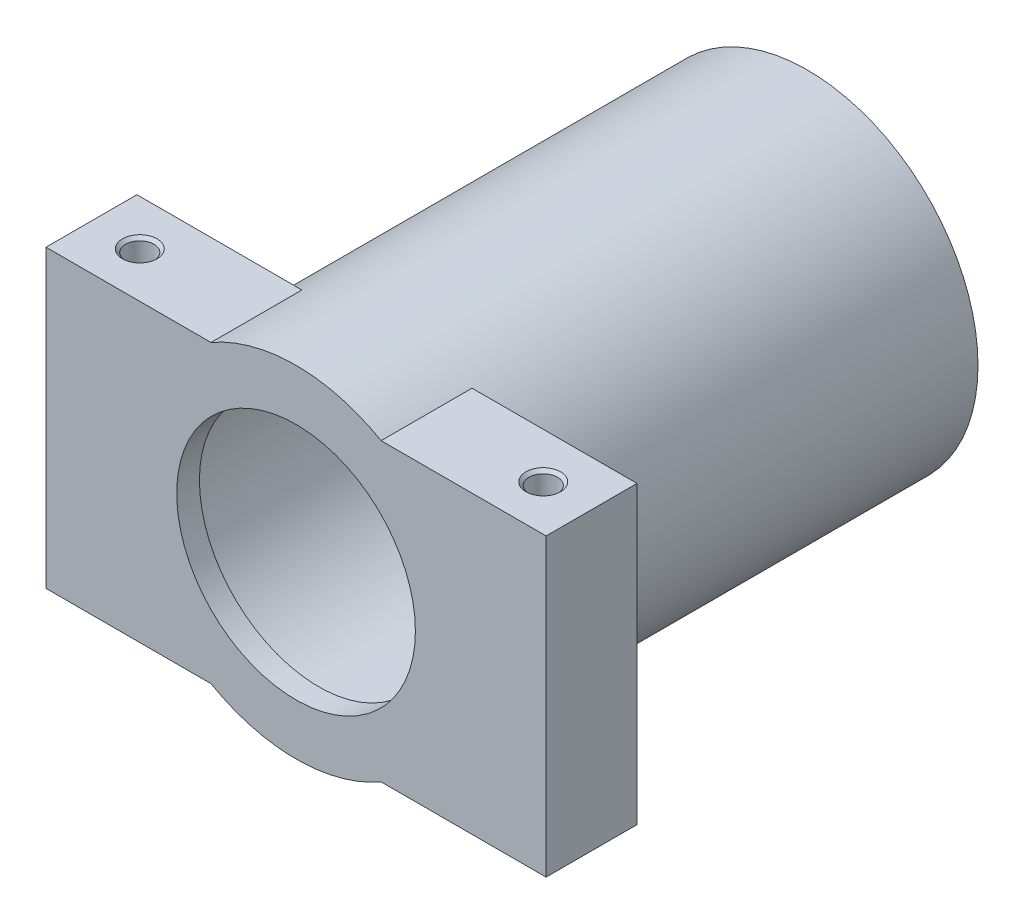
ISO-10303-21;
HEADER;
FILE_DESCRIPTION(('STEP AP214'),'2;1');
FILE_NAME('part.step','',(''),(''),'','','');
FILE_SCHEMA(('AUTOMOTIVE_DESIGN { 1 0 10303 214 1 1 1 1 }'));
ENDSEC;
DATA;
#1=APPLICATION_CONTEXT('core data for automotive mechanical design processes');
#2=APPLICATION_PROTOCOL_DEFINITION('international standard','automotive_design',2000,#1);
#3=PRODUCT_CONTEXT('',#1,'mechanical');
#4=PRODUCT('Part','Part','',(#3));
#5=PRODUCT_RELATED_PRODUCT_CATEGORY('part','',(#4));
#6=PRODUCT_DEFINITION_FORMATION('','',#4);
#7=PRODUCT_DEFINITION_CONTEXT('part definition',#1,'design');
#8=PRODUCT_DEFINITION('design','',#6,#7);
#9=PRODUCT_DEFINITION_SHAPE('','',#8);
#10=(LENGTH_UNIT() NAMED_UNIT(*) SI_UNIT(.MILLI.,.METRE.));
#11=(NAMED_UNIT(*) PLANE_ANGLE_UNIT() SI_UNIT($,.RADIAN.));
#12=(NAMED_UNIT(*) SI_UNIT($,.STERADIAN.) SOLID_ANGLE_UNIT());
#13=UNCERTAINTY_MEASURE_WITH_UNIT(LENGTH_MEASURE(1.E-05),#10,'distance_accuracy_value','');
#14=(GEOMETRIC_REPRESENTATION_CONTEXT(3) GLOBAL_UNCERTAINTY_ASSIGNED_CONTEXT((#13)) GLOBAL_UNIT_ASSIGNED_CONTEXT((#10,
#11,#12)) REPRESENTATION_CONTEXT('',''));
#15=CARTESIAN_POINT('',(0.,0.,0.));
#16=DIRECTION('',(0.,0.,1.));
#17=DIRECTION('',(1.,0.,0.));
#18=AXIS2_PLACEMENT_3D('',#15,#16,#17);
#19=CARTESIAN_POINT('',(0.,0.,37.));
#20=DIRECTION('',(0.,0.,1.));
#21=DIRECTION('',(1.,0.,0.));
#22=AXIS2_PLACEMENT_3D('',#19,#20,#21);
#23=CYLINDRICAL_SURFACE('',#22,10.5);
#24=CARTESIAN_POINT('',(0.,0.,45.));
#25=DIRECTION('',(0.,0.,1.));
#26=DIRECTION('',(1.,0.,0.));
#27=AXIS2_PLACEMENT_3D('',#24,#25,#26);
#28=CIRCLE('',#27,10.5);
#29=CARTESIAN_POINT('',(10.5,0.,45.));
#30=VERTEX_POINT('',#29);
#31=EDGE_CURVE('E137',#30,#30,#28,.T.);
#32=ORIENTED_EDGE('',*,*,#31,.T.);
#33=EDGE_LOOP('',(#32));
#34=FACE_BOUND('',#33,.T.);
#35=CARTESIAN_POINT('',(0.,0.,43.));
#36=DIRECTION('',(0.,0.,-1.));
#37=DIRECTION('',(-1.,0.,0.));
#38=AXIS2_PLACEMENT_3D('',#35,#36,#37);
#39=CIRCLE('',#38,10.5);
#40=CARTESIAN_POINT('',(-10.5,0.,43.));
#41=VERTEX_POINT('',#40);
#42=EDGE_CURVE('E43',#41,#41,#39,.F.);
#43=ORIENTED_EDGE('',*,*,#42,.F.);
#44=EDGE_LOOP('',(#43));
#45=FACE_BOUND('',#44,.T.);
#46=ADVANCED_FACE('F38',(#34,#45),#23,.F.);
#47=CARTESIAN_POINT('',(0.,0.,45.));
#48=DIRECTION('',(0.,0.,-1.));
#49=DIRECTION('',(-1.,0.,0.));
#50=AXIS2_PLACEMENT_3D('',#47,#48,#49);
#51=CYLINDRICAL_SURFACE('',#50,12.5);
#52=CARTESIAN_POINT('',(0.,-12.5,24.25));
#53=CARTESIAN_POINT('',(0.0700254422394448,-12.4999991940096,24.2499969676245));
#54=CARTESIAN_POINT('',(0.140097181459714,-12.4994053199526,24.2440959138794));
#55=CARTESIAN_POINT('',(0.278297998121044,-12.4970933449342,24.220644537137));
#56=CARTESIAN_POINT('',(0.346424848961032,-12.4953740054253,24.2030813799693));
#57=CARTESIAN_POINT('',(0.478714594316765,-12.4910051820384,24.1568221992527));
#58=CARTESIAN_POINT('',(0.542879855768633,-12.4883562600088,24.1281328993519));
#59=CARTESIAN_POINT('',(0.665470201200504,-12.4824244674288,24.0604488650854));
#60=CARTESIAN_POINT('',(0.723896423473841,-12.4791417229766,24.0214561799998));
#61=CARTESIAN_POINT('',(0.833574438342599,-12.4722968042665,23.9341216279222));
#62=CARTESIAN_POINT('',(0.884802681043612,-12.4687337696733,23.8857502507475));
#63=CARTESIAN_POINT('',(0.978428151788726,-12.4617369613283,23.7810943321712));
#64=CARTESIAN_POINT('',(1.02082497135331,-12.4583031935615,23.724809424947));
#65=CARTESIAN_POINT('',(1.09566746305452,-12.4519448944098,23.6057768353955));
#66=CARTESIAN_POINT('',(1.12809183181859,-12.4490214588863,23.5430156948814));
#67=CARTESIAN_POINT('',(1.18193298092844,-12.4440254693316,23.4129055176188));
#68=CARTESIAN_POINT('',(1.20335003323911,-12.4419528942778,23.3455565942701));
#69=CARTESIAN_POINT('',(1.23449880200236,-12.4389010509122,23.2084227489175));
#70=CARTESIAN_POINT('',(1.24426956625474,-12.4379181299762,23.1386467789347));
#71=CARTESIAN_POINT('',(1.2519691064192,-12.4371455382566,22.9984389207553));
#72=CARTESIAN_POINT('',(1.2498981935885,-12.4373558361093,22.9280070498474));
#73=CARTESIAN_POINT('',(1.23400535031584,-12.4389425862367,22.7887558628834));
#74=CARTESIAN_POINT('',(1.22022605515569,-12.4403148073831,22.7199316258391));
#75=CARTESIAN_POINT('',(1.18137393018823,-12.4440641785927,22.5855775459986));
#76=CARTESIAN_POINT('',(1.15630094781968,-12.4464413422311,22.5200477477187));
#77=CARTESIAN_POINT('',(1.09552611735188,-12.4519376181509,22.3940080158764));
#78=CARTESIAN_POINT('',(1.05980535339997,-12.455058048852,22.3335072631384));
#79=CARTESIAN_POINT('',(0.978762534191531,-12.461688146661,22.2193434813602));
#80=CARTESIAN_POINT('',(0.933440197920629,-12.4651978251598,22.1656806525228));
#81=CARTESIAN_POINT('',(0.834242640515084,-12.4722298164124,22.0664682575137));
#82=CARTESIAN_POINT('',(0.780330598564201,-12.4757521166625,22.020955497649));
#83=CARTESIAN_POINT('',(0.665611852171387,-12.4823978634815,21.939620458862));
#84=CARTESIAN_POINT('',(0.604805139999496,-12.4855213096032,21.9037981908044));
#85=CARTESIAN_POINT('',(0.477997632115451,-12.4910184458387,21.8428624746122));
#86=CARTESIAN_POINT('',(0.411995932987375,-12.4933920051846,21.8177508939774));
#87=CARTESIAN_POINT('',(0.276684021662413,-12.4971205930176,21.7789763541103));
#88=CARTESIAN_POINT('',(0.207373908470749,-12.4984756519633,21.7653130525117));
#89=CARTESIAN_POINT('',(0.0677313738648796,-12.5000106458539,21.7498696153315));
#90=CARTESIAN_POINT('',(-0.00259537763186505,-12.5001956033467,21.7480386896844));
#91=CARTESIAN_POINT('',(-0.142554741644625,-12.49938302196,21.756178578811));
#92=CARTESIAN_POINT('',(-0.212187363525588,-12.4983854990559,21.7661492341441));
#93=CARTESIAN_POINT('',(-0.348635258543344,-12.4953232692399,21.797567119277));
#94=CARTESIAN_POINT('',(-0.415456061215025,-12.4932607739755,21.8189905680975));
#95=CARTESIAN_POINT('',(-0.544555401729727,-12.4882999857576,21.8726814675466));
#96=CARTESIAN_POINT('',(-0.606833837696396,-12.4854016740657,21.9049491612992));
#97=CARTESIAN_POINT('',(-0.725310225215177,-12.4790809416303,21.9795385483299));
#98=CARTESIAN_POINT('',(-0.781487074686145,-12.475656795043,22.0218936111573));
#99=CARTESIAN_POINT('',(-0.885952029139846,-12.468674160869,22.1154075846762));
#100=CARTESIAN_POINT('',(-0.934239936061469,-12.4651156699121,22.1665667163379));
#101=CARTESIAN_POINT('',(-1.02173263735893,-12.4582503017594,22.2764582183238));
#102=CARTESIAN_POINT('',(-1.06090409834943,-12.4549443767372,22.3352171956783));
#103=CARTESIAN_POINT('',(-1.12882282342978,-12.4489729057611,22.4585092001834));
#104=CARTESIAN_POINT('',(-1.15757023006735,-12.4463073510505,22.5230421483605));
#105=CARTESIAN_POINT('',(-1.20376901085559,-12.4419243454256,22.6559359243322));
#106=CARTESIAN_POINT('',(-1.22124021851483,-12.4402052306224,22.7242898001139));
#107=CARTESIAN_POINT('',(-1.24445500891183,-12.437904566036,22.862978997451));
#108=CARTESIAN_POINT('',(-1.25019892799939,-12.4373229836273,22.9333142621196));
#109=CARTESIAN_POINT('',(-1.24979142308907,-12.4373639138445,23.0736383604459));
#110=CARTESIAN_POINT('',(-1.24369236199139,-12.4379811260876,23.1436273536035));
#111=CARTESIAN_POINT('',(-1.21988181620456,-12.4403387986193,23.2815811464604));
#112=CARTESIAN_POINT('',(-1.2021703184527,-12.4420792601715,23.3495459438825));
#113=CARTESIAN_POINT('',(-1.15565210787188,-12.4464858532898,23.4815216863098));
#114=CARTESIAN_POINT('',(-1.12684693042614,-12.4491518567545,23.5455331770372));
#115=CARTESIAN_POINT('',(-1.0589644436388,-12.455109397992,23.6678211145888));
#116=CARTESIAN_POINT('',(-1.01988719181927,-12.4584009322619,23.7260975935258));
#117=CARTESIAN_POINT('',(-0.932373195356663,-12.4652560901212,23.8355295930899));
#118=CARTESIAN_POINT('',(-0.883897436112835,-12.4688208090844,23.8866538454589));
#119=CARTESIAN_POINT('',(-0.779039624031386,-12.4758106841098,23.9800652908746));
#120=CARTESIAN_POINT('',(-0.72265568013532,-12.4792358065372,24.0223503641965));
#121=CARTESIAN_POINT('',(-0.603426792701611,-12.4855695258645,24.0969668173183));
#122=CARTESIAN_POINT('',(-0.540565936683454,-12.4884768003351,24.1292728636815));
#123=CARTESIAN_POINT('',(-0.410322848875688,-12.4934328656237,24.1828280285298));
#124=CARTESIAN_POINT('',(-0.342945812282012,-12.4954826238707,24.2040896136919));
#125=CARTESIAN_POINT('',(-0.229322826757131,-12.4979776721717,24.229650771356));
#126=CARTESIAN_POINT('',(-0.183803191055637,-12.4987325086479,24.2372713053742));
#127=CARTESIAN_POINT('',(-0.0921957260216422,-12.4997439368848,24.2474469075772));
#128=CARTESIAN_POINT('',(-0.0461078990331985,-12.5000005307003,24.2500019966523));
#129=CARTESIAN_POINT('',(0.,-12.5,24.25));
#130=B_SPLINE_CURVE_WITH_KNOTS('',3,(#52,#53,#54,#55,#56,#57,#58,#59,#60,#61,#62,#63,#64,#65,
#66,#67,#68,#69,#70,#71,#72,#73,#74,#75,#76,#77,#78,#79,#80,#81,#82,#83,#84,#85,#86,#87,#88,#89,
#90,#91,#92,#93,#94,#95,#96,#97,#98,#99,#100,#101,#102,#103,#104,#105,#106,#107,#108,#109,#110,
#111,#112,#113,#114,#115,#116,#117,#118,#119,#120,#121,#122,#123,#124,#125,#126,#127,#128,#129),
.UNSPECIFIED.,.T.,.F.,(4,2,2,2,2,2,2,2,2,2,2,2,2,2,2,2,2,2,2,2,2,2,2,2,2,2,2,2,2,2,2,2,2,2,2,2,
2,2,4),(0.,0.209907957835591,0.420047303544357,0.630059857165251,0.840030671978474,
1.05067321077868,1.26132549025882,1.47242469340277,1.68351868053129,1.89390290056495,
2.1042815906972,2.31389746801388,2.52351617702041,2.73350951716117,2.94350900413906,
3.15443417745258,3.36535958724714,3.57632175866976,3.78727762094298,3.99732735759696,
4.20737425648928,4.4169866911788,4.62660382561833,4.83692425935872,5.04724997262786,
5.25833304510747,5.46941323094216,5.68012113241253,5.8908229904948,6.10059536617444,
6.31036797782548,6.52011156703498,6.72985398173698,6.94048646784565,7.15116940796195,
7.36238288782801,7.57335743494117,7.71157084040434,7.84978367586282),.UNSPECIFIED.);
#131=CARTESIAN_POINT('',(0.,-12.5,24.25));
#132=VERTEX_POINT('',#131);
#133=EDGE_CURVE('E201',#132,#132,#130,.T.);
#134=ORIENTED_EDGE('',*,*,#133,.F.);
#135=EDGE_LOOP('',(#134));
#136=FACE_BOUND('',#135,.T.);
#137=CARTESIAN_POINT('',(0.,12.5,24.25));
#138=CARTESIAN_POINT('',(-0.0700254422394479,12.4999991940096,24.2499969676245));
#139=CARTESIAN_POINT('',(-0.140097181459717,12.4994053199526,24.2440959138794));
#140=CARTESIAN_POINT('',(-0.278297998121047,12.4970933449342,24.220644537137));
#141=CARTESIAN_POINT('',(-0.346424848961035,12.4953740054253,24.2030813799693));
#142=CARTESIAN_POINT('',(-0.478714594316768,12.4910051820384,24.1568221992527));
#143=CARTESIAN_POINT('',(-0.542879855768636,12.4883562600089,24.1281328993519));
#144=CARTESIAN_POINT('',(-0.665470201200507,12.4824244674288,24.0604488650854));
#145=CARTESIAN_POINT('',(-0.723896423473844,12.4791417229766,24.0214561799998));
#146=CARTESIAN_POINT('',(-0.833574438342602,12.4722968042665,23.9341216279222));
#147=CARTESIAN_POINT('',(-0.884802681043615,12.4687337696733,23.8857502507475));
#148=CARTESIAN_POINT('',(-0.97842815178873,12.4617369613283,23.7810943321712));
#149=CARTESIAN_POINT('',(-1.02082497135332,12.4583031935615,23.724809424947));
#150=CARTESIAN_POINT('',(-1.09566746305452,12.4519448944098,23.6057768353955));
#151=CARTESIAN_POINT('',(-1.1280918318186,12.4490214588863,23.5430156948814));
#152=CARTESIAN_POINT('',(-1.18193298092845,12.4440254693316,23.4129055176188));
#153=CARTESIAN_POINT('',(-1.20335003323911,12.4419528942778,23.3455565942701));
#154=CARTESIAN_POINT('',(-1.23449880200237,12.4389010509122,23.2084227489175));
#155=CARTESIAN_POINT('',(-1.24426956625474,12.4379181299762,23.1386467789347));
#156=CARTESIAN_POINT('',(-1.2519691064192,12.4371455382566,22.9984389207553));
#157=CARTESIAN_POINT('',(-1.2498981935885,12.4373558361093,22.9280070498474));
#158=CARTESIAN_POINT('',(-1.23400535031585,12.4389425862367,22.7887558628833));
#159=CARTESIAN_POINT('',(-1.22022605515569,12.4403148073831,22.7199316258391));
#160=CARTESIAN_POINT('',(-1.18137393018823,12.4440641785927,22.5855775459986));
#161=CARTESIAN_POINT('',(-1.15630094781968,12.4464413422311,22.5200477477187));
#162=CARTESIAN_POINT('',(-1.09552611735188,12.4519376181509,22.3940080158764));
#163=CARTESIAN_POINT('',(-1.05980535339997,12.455058048852,22.3335072631384));
#164=CARTESIAN_POINT('',(-0.978762534191534,12.461688146661,22.2193434813602));
#165=CARTESIAN_POINT('',(-0.933440197920632,12.4651978251598,22.1656806525228));
#166=CARTESIAN_POINT('',(-0.834242640515087,12.4722298164124,22.0664682575137));
#167=CARTESIAN_POINT('',(-0.780330598564205,12.4757521166625,22.020955497649));
#168=CARTESIAN_POINT('',(-0.66561185217139,12.4823978634815,21.939620458862));
#169=CARTESIAN_POINT('',(-0.6048051399995,12.4855213096032,21.9037981908044));
#170=CARTESIAN_POINT('',(-0.477997632115454,12.4910184458387,21.8428624746122));
#171=CARTESIAN_POINT('',(-0.411995932987378,12.4933920051846,21.8177508939774));
#172=CARTESIAN_POINT('',(-0.276684021662415,12.4971205930176,21.7789763541103));
#173=CARTESIAN_POINT('',(-0.207373908470751,12.4984756519633,21.7653130525117));
#174=CARTESIAN_POINT('',(-0.0677313738648814,12.5000106458539,21.7498696153315));
#175=CARTESIAN_POINT('',(0.0025953776318632,12.5001956033467,21.7480386896844));
#176=CARTESIAN_POINT('',(0.142554741644623,12.49938302196,21.756178578811));
#177=CARTESIAN_POINT('',(0.212187363525585,12.4983854990559,21.7661492341441));
#178=CARTESIAN_POINT('',(0.348635258543341,12.4953232692399,21.797567119277));
#179=CARTESIAN_POINT('',(0.415456061215021,12.4932607739755,21.8189905680975));
#180=CARTESIAN_POINT('',(0.544555401729723,12.4882999857576,21.8726814675466));
#181=CARTESIAN_POINT('',(0.606833837696393,12.4854016740657,21.9049491612992));
#182=CARTESIAN_POINT('',(0.725310225215174,12.4790809416303,21.9795385483299));
#183=CARTESIAN_POINT('',(0.781487074686142,12.475656795043,22.0218936111573));
#184=CARTESIAN_POINT('',(0.885952029139843,12.468674160869,22.1154075846762));
#185=CARTESIAN_POINT('',(0.934239936061466,12.4651156699121,22.1665667163379));
#186=CARTESIAN_POINT('',(1.02173263735893,12.4582503017594,22.2764582183238));
#187=CARTESIAN_POINT('',(1.06090409834942,12.4549443767372,22.3352171956783));
#188=CARTESIAN_POINT('',(1.12882282342978,12.4489729057611,22.4585092001834));
#189=CARTESIAN_POINT('',(1.15757023006735,12.4463073510505,22.5230421483605));
#190=CARTESIAN_POINT('',(1.20376901085559,12.4419243454256,22.6559359243322));
#191=CARTESIAN_POINT('',(1.22124021851482,12.4402052306224,22.7242898001139));
#192=CARTESIAN_POINT('',(1.24445500891182,12.437904566036,22.862978997451));
#193=CARTESIAN_POINT('',(1.25019892799939,12.4373229836273,22.9333142621196));
#194=CARTESIAN_POINT('',(1.24979142308907,12.4373639138445,23.0736383604459));
#195=CARTESIAN_POINT('',(1.24369236199139,12.4379811260876,23.1436273536035));
#196=CARTESIAN_POINT('',(1.21988181620456,12.4403387986193,23.2815811464604));
#197=CARTESIAN_POINT('',(1.20217031845269,12.4420792601715,23.3495459438825));
#198=CARTESIAN_POINT('',(1.15565210787188,12.4464858532898,23.4815216863098));
#199=CARTESIAN_POINT('',(1.12684693042614,12.4491518567545,23.5455331770372));
#200=CARTESIAN_POINT('',(1.0589644436388,12.455109397992,23.6678211145888));
#201=CARTESIAN_POINT('',(1.01988719181927,12.4584009322619,23.7260975935258));
#202=CARTESIAN_POINT('',(0.932373195356662,12.4652560901212,23.8355295930899));
#203=CARTESIAN_POINT('',(0.883897436112833,12.4688208090844,23.8866538454589));
#204=CARTESIAN_POINT('',(0.779039624031384,12.4758106841098,23.9800652908746));
#205=CARTESIAN_POINT('',(0.722655680135317,12.4792358065372,24.0223503641965));
#206=CARTESIAN_POINT('',(0.603426792701608,12.4855695258645,24.0969668173183));
#207=CARTESIAN_POINT('',(0.540565936683451,12.4884768003351,24.1292728636815));
#208=CARTESIAN_POINT('',(0.410322848875685,12.4934328656237,24.1828280285298));
#209=CARTESIAN_POINT('',(0.342945812282008,12.4954826238707,24.2040896136919));
#210=CARTESIAN_POINT('',(0.229322826757128,12.4979776721717,24.229650771356));
#211=CARTESIAN_POINT('',(0.183803191055634,12.4987325086479,24.2372713053742));
#212=CARTESIAN_POINT('',(0.0921957260216392,12.4997439368848,24.2474469075772));
#213=CARTESIAN_POINT('',(0.0461078990331955,12.5000005307003,24.2500019966523));
#214=CARTESIAN_POINT('',(0.,12.5,24.25));
#215=B_SPLINE_CURVE_WITH_KNOTS('',3,(#137,#138,#139,#140,#141,#142,#143,#144,#145,#146,#147,
#148,#149,#150,#151,#152,#153,#154,#155,#156,#157,#158,#159,#160,#161,#162,#163,#164,#165,#166,
#167,#168,#169,#170,#171,#172,#173,#174,#175,#176,#177,#178,#179,#180,#181,#182,#183,#184,#185,
#186,#187,#188,#189,#190,#191,#192,#193,#194,#195,#196,#197,#198,#199,#200,#201,#202,#203,#204,
#205,#206,#207,#208,#209,#210,#211,#212,#213,#214),.UNSPECIFIED.,.T.,.F.,(4,2,2,2,2,2,2,2,2,2,2,
2,2,2,2,2,2,2,2,2,2,2,2,2,2,2,2,2,2,2,2,2,2,2,2,2,2,2,4),(0.,0.209907957835591,
0.420047303544357,0.630059857165251,0.840030671978474,1.05067321077868,1.26132549025882,
1.47242469340277,1.68351868053129,1.89390290056495,2.1042815906972,2.31389746801388,
2.52351617702041,2.73350951716117,2.94350900413906,3.15443417745257,3.36535958724714,
3.57632175866976,3.78727762094298,3.99732735759696,4.20737425648928,4.4169866911788,
4.62660382561832,4.83692425935872,5.04724997262786,5.25833304510747,5.46941323094216,
5.68012113241253,5.8908229904948,6.10059536617444,6.31036797782548,6.52011156703498,
6.72985398173698,6.94048646784565,7.15116940796196,7.36238288782801,7.57335743494117,
7.71157084040434,7.84978367586282),.UNSPECIFIED.);
#216=CARTESIAN_POINT('',(0.,12.5,24.25));
#217=VERTEX_POINT('',#216);
#218=EDGE_CURVE('E195',#217,#217,#215,.T.);
#219=ORIENTED_EDGE('',*,*,#218,.F.);
#220=EDGE_LOOP('',(#219));
#221=FACE_BOUND('',#220,.T.);
#222=CARTESIAN_POINT('',(0.,0.,0.));
#223=DIRECTION('',(0.,0.,1.));
#224=DIRECTION('',(1.,0.,0.));
#225=AXIS2_PLACEMENT_3D('',#222,#223,#224);
#226=CIRCLE('',#225,12.5);
#227=CARTESIAN_POINT('',(12.5,0.,0.));
#228=VERTEX_POINT('',#227);
#229=EDGE_CURVE('E158',#228,#228,#226,.T.);
#230=ORIENTED_EDGE('',*,*,#229,.F.);
#231=EDGE_LOOP('',(#230));
#232=FACE_BOUND('',#231,.T.);
#233=CARTESIAN_POINT('',(0.,0.,43.));
#234=DIRECTION('',(0.,0.,-1.));
#235=DIRECTION('',(-1.,0.,0.));
#236=AXIS2_PLACEMENT_3D('',#233,#234,#235);
#237=CIRCLE('',#236,12.5);
#238=CARTESIAN_POINT('',(-12.5,0.,43.));
#239=VERTEX_POINT('',#238);
#240=EDGE_CURVE('E284',#239,#239,#237,.T.);
#241=ORIENTED_EDGE('',*,*,#240,.F.);
#242=EDGE_LOOP('',(#241));
#243=FACE_BOUND('',#242,.T.);
#244=ADVANCED_FACE('F206',(#136,#221,#232,#243),#51,.F.);
#245=CARTESIAN_POINT('',(0.,0.,45.));
#246=DIRECTION('',(0.,0.,1.));
#247=DIRECTION('',(1.,0.,0.));
#248=AXIS2_PLACEMENT_3D('',#245,#246,#247);
#249=PLANE('',#248);
#250=CARTESIAN_POINT('',(0.,0.,45.));
#251=DIRECTION('',(0.,0.,1.));
#252=DIRECTION('',(1.,0.,0.));
#253=AXIS2_PLACEMENT_3D('',#250,#251,#252);
#254=CIRCLE('',#253,15.);
#255=CARTESIAN_POINT('',(-7.48331477354788,-13.,45.));
#256=VERTEX_POINT('',#255);
#257=CARTESIAN_POINT('',(7.48331477354789,-13.,45.));
#258=VERTEX_POINT('',#257);
#259=EDGE_CURVE('E165',#256,#258,#254,.T.);
#260=ORIENTED_EDGE('',*,*,#259,.T.);
#261=DIRECTION('',(1.,0.,0.));
#262=VECTOR('',#261,1.);
#263=CARTESIAN_POINT('',(22.,-13.,45.));
#264=LINE('',#263,#262);
#265=CARTESIAN_POINT('',(22.,-13.,45.));
#266=VERTEX_POINT('',#265);
#267=EDGE_CURVE('E147',#258,#266,#264,.T.);
#268=ORIENTED_EDGE('',*,*,#267,.T.);
#269=DIRECTION('',(0.,1.,0.));
#270=VECTOR('',#269,1.);
#271=CARTESIAN_POINT('',(22.,-13.,45.));
#272=LINE('',#271,#270);
#273=CARTESIAN_POINT('',(22.,13.,45.));
#274=VERTEX_POINT('',#273);
#275=EDGE_CURVE('E149',#266,#274,#272,.T.);
#276=ORIENTED_EDGE('',*,*,#275,.T.);
#277=DIRECTION('',(-1.,0.,0.));
#278=VECTOR('',#277,1.);
#279=CARTESIAN_POINT('',(22.,13.,45.));
#280=LINE('',#279,#278);
#281=CARTESIAN_POINT('',(7.48331477354789,13.,45.));
#282=VERTEX_POINT('',#281);
#283=EDGE_CURVE('E63',#274,#282,#280,.T.);
#284=ORIENTED_EDGE('',*,*,#283,.T.);
#285=CARTESIAN_POINT('',(-7.48331477354789,13.,45.));
#286=VERTEX_POINT('',#285);
#287=EDGE_CURVE('E162',#282,#286,#254,.T.);
#288=ORIENTED_EDGE('',*,*,#287,.T.);
#289=CARTESIAN_POINT('',(-22.,13.,45.));
#290=VERTEX_POINT('',#289);
#291=EDGE_CURVE('E134',#286,#290,#280,.T.);
#292=ORIENTED_EDGE('',*,*,#291,.T.);
#293=DIRECTION('',(0.,-1.,0.));
#294=VECTOR('',#293,1.);
#295=CARTESIAN_POINT('',(-22.,-13.,45.));
#296=LINE('',#295,#294);
#297=CARTESIAN_POINT('',(-22.,-13.,45.));
#298=VERTEX_POINT('',#297);
#299=EDGE_CURVE('E145',#290,#298,#296,.T.);
#300=ORIENTED_EDGE('',*,*,#299,.T.);
#301=EDGE_CURVE('E56',#298,#256,#264,.T.);
#302=ORIENTED_EDGE('',*,*,#301,.T.);
#303=EDGE_LOOP('',(#260,#268,#276,#284,#288,#292,#300,#302));
#304=FACE_BOUND('',#303,.T.);
#305=ORIENTED_EDGE('',*,*,#31,.F.);
#306=EDGE_LOOP('',(#305));
#307=FACE_BOUND('',#306,.T.);
#308=ADVANCED_FACE('F211',(#304,#307),#249,.T.);
#309=CARTESIAN_POINT('',(0.,0.,0.));
#310=DIRECTION('',(0.,0.,1.));
#311=DIRECTION('',(1.,0.,0.));
#312=AXIS2_PLACEMENT_3D('',#309,#310,#311);
#313=PLANE('',#312);
#314=CARTESIAN_POINT('',(0.,0.,0.));
#315=DIRECTION('',(0.,0.,1.));
#316=DIRECTION('',(1.,0.,0.));
#317=AXIS2_PLACEMENT_3D('',#314,#315,#316);
#318=CIRCLE('',#317,15.);
#319=CARTESIAN_POINT('',(15.,0.,0.));
#320=VERTEX_POINT('',#319);
#321=EDGE_CURVE('E161',#320,#320,#318,.T.);
#322=ORIENTED_EDGE('',*,*,#321,.F.);
#323=EDGE_LOOP('',(#322));
#324=FACE_BOUND('',#323,.T.);
#325=ORIENTED_EDGE('',*,*,#229,.T.);
#326=EDGE_LOOP('',(#325));
#327=FACE_BOUND('',#326,.T.);
#328=ADVANCED_FACE('F216',(#324,#327),#313,.F.);
#329=CARTESIAN_POINT('',(0.,0.,45.));
#330=DIRECTION('',(0.,0.,-1.));
#331=DIRECTION('',(-1.,0.,0.));
#332=AXIS2_PLACEMENT_3D('',#329,#330,#331);
#333=CYLINDRICAL_SURFACE('',#332,15.);
#334=CARTESIAN_POINT('',(0.,-15.,24.25));
#335=CARTESIAN_POINT('',(0.0700826124015035,-14.999999317644,24.2499969389671));
#336=CARTESIAN_POINT('',(0.14021293397528,-14.9995036067925,24.2440862877362));
#337=CARTESIAN_POINT('',(0.278533213375484,-14.9975737791031,24.2205945601811));
#338=CARTESIAN_POINT('',(0.346720881531535,-14.9961385991462,24.2030002621189));
#339=CARTESIAN_POINT('',(0.479132528142823,-14.9924920155763,24.1566535577383));
#340=CARTESIAN_POINT('',(0.543358725530766,-14.9902810512311,24.1279074648627));
#341=CARTESIAN_POINT('',(0.666059041770092,-14.9853308468089,24.06008446016));
#342=CARTESIAN_POINT('',(0.724534387356732,-14.982591719767,24.0210097581531));
#343=CARTESIAN_POINT('',(0.834237499956984,-14.9768847483339,23.9335311667425));
#344=CARTESIAN_POINT('',(0.885448590520197,-14.9739164010822,23.8851063950804));
#345=CARTESIAN_POINT('',(0.979026416920687,-14.9680897600396,23.7803463801876));
#346=CARTESIAN_POINT('',(1.02139276421438,-14.965231471088,23.7240107896217));
#347=CARTESIAN_POINT('',(1.09613490298778,-14.9599431582655,23.6049273536262));
#348=CARTESIAN_POINT('',(1.12849604118942,-14.9575137647512,23.5421702807465));
#349=CARTESIAN_POINT('',(1.1822155422173,-14.9533640556034,23.412089630555));
#350=CARTESIAN_POINT('',(1.20357409939052,-14.9516437274454,23.3447661339272));
#351=CARTESIAN_POINT('',(1.23463378727321,-14.949111150829,23.2076307601485));
#352=CARTESIAN_POINT('',(1.24436208173721,-14.9482967867027,23.1378250750092));
#353=CARTESIAN_POINT('',(1.25196901001928,-14.9476616540184,22.9975672450683));
#354=CARTESIAN_POINT('',(1.24984786622442,-14.9478408668132,22.9271151124237));
#355=CARTESIAN_POINT('',(1.23383858026856,-14.9491707170205,22.7877504181118));
#356=CARTESIAN_POINT('',(1.21997996004757,-14.9503189172232,22.7188344386545));
#357=CARTESIAN_POINT('',(1.18093498172867,-14.9534535446171,22.5843101657588));
#358=CARTESIAN_POINT('',(1.15574851299598,-14.955439979995,22.5187019046327));
#359=CARTESIAN_POINT('',(1.09472973519004,-14.9600300588357,22.3925613676524));
#360=CARTESIAN_POINT('',(1.05888418094649,-14.962634469387,22.3320355280156));
#361=CARTESIAN_POINT('',(0.977574304891682,-14.9681663357985,22.2178483264752));
#362=CARTESIAN_POINT('',(0.932109788278174,-14.9710937982004,22.1641871036285));
#363=CARTESIAN_POINT('',(0.832686977782951,-14.9769527551456,22.065080725898));
#364=CARTESIAN_POINT('',(0.778703161738216,-14.9798842346883,22.0196611698384));
#365=CARTESIAN_POINT('',(0.663863195464687,-14.9854123983729,21.9385253457643));
#366=CARTESIAN_POINT('',(0.60300704064417,-14.9880090822911,21.9028090842331));
#367=CARTESIAN_POINT('',(0.476133241584813,-14.9925755726205,21.8420952966641));
#368=CARTESIAN_POINT('',(0.410115052261341,-14.994545312718,21.8170989044023));
#369=CARTESIAN_POINT('',(0.274798836274475,-14.9976352176475,21.7785523344358));
#370=CARTESIAN_POINT('',(0.205500877711067,-14.9987554001111,21.7650019191809));
#371=CARTESIAN_POINT('',(0.0658141252053121,-15.0000177117881,21.749764044948));
#372=CARTESIAN_POINT('',(-0.00457078639399648,-15.00016275615,21.7480412273664));
#373=CARTESIAN_POINT('',(-0.14462844062913,-14.9994662347338,21.7564148257841));
#374=CARTESIAN_POINT('',(-0.214301189901767,-14.9986246781584,21.7665111315368));
#375=CARTESIAN_POINT('',(-0.350855945280874,-14.9960514730165,21.7982070732626));
#376=CARTESIAN_POINT('',(-0.417741781424653,-14.9943210927178,21.8197903200323));
#377=CARTESIAN_POINT('',(-0.546942706353111,-14.9901646264044,21.8738307347275));
#378=CARTESIAN_POINT('',(-0.609257722853915,-14.9877385293905,21.9062880745731));
#379=CARTESIAN_POINT('',(-0.727709022877383,-14.9824553299204,21.9812441865204));
#380=CARTESIAN_POINT('',(-0.783830438151836,-14.9795972277342,22.0237663829935));
#381=CARTESIAN_POINT('',(-0.888151368554525,-14.9737744829962,22.1176113213131));
#382=CARTESIAN_POINT('',(-0.936350746017978,-14.9708098385941,22.1689342160616));
#383=CARTESIAN_POINT('',(-1.02358068181888,-14.9650995151978,22.2790771152479));
#384=CARTESIAN_POINT('',(-1.06258816654205,-14.9623543984278,22.3379154264967));
#385=CARTESIAN_POINT('',(-1.1301688285494,-14.957401896804,22.4613278285793));
#386=CARTESIAN_POINT('',(-1.15874211001245,-14.9551945065814,22.5259018621374));
#387=CARTESIAN_POINT('',(-1.2046039718007,-14.9515705356118,22.6588709881741));
#388=CARTESIAN_POINT('',(-1.22190667681161,-14.9501529653579,22.7272611808929));
#389=CARTESIAN_POINT('',(-1.24478221238769,-14.9482658211356,22.865988374843));
#390=CARTESIAN_POINT('',(-1.25035526821033,-14.9477962289621,22.936325338662));
#391=CARTESIAN_POINT('',(-1.24961070361366,-14.9478584743774,23.0767201575261));
#392=CARTESIAN_POINT('',(-1.24332933722174,-14.9483872586634,23.1467782090455));
#393=CARTESIAN_POINT('',(-1.21912982911879,-14.9503801885288,23.2848406669386));
#394=CARTESIAN_POINT('',(-1.20121166965953,-14.9518443355349,23.3528450701798));
#395=CARTESIAN_POINT('',(-1.15425638752133,-14.9555422141463,23.4848722040833));
#396=CARTESIAN_POINT('',(-1.12521991750817,-14.9577759005774,23.5488951682071));
#397=CARTESIAN_POINT('',(-1.05685632368406,-14.9627612484384,23.6711635507171));
#398=CARTESIAN_POINT('',(-1.0175293613932,-14.9655129017381,23.7294090597667));
#399=CARTESIAN_POINT('',(-0.929564927653059,-14.9712341462335,23.8386546737663));
#400=CARTESIAN_POINT('',(-0.880900617176823,-14.9742043500718,23.8896331358217));
#401=CARTESIAN_POINT('',(-0.775691531990582,-14.980022437621,23.9827189815041));
#402=CARTESIAN_POINT('',(-0.719144853301366,-14.9828702915603,24.02482421562));
#403=CARTESIAN_POINT('',(-0.599667216286771,-14.9881279355284,24.099024825522));
#404=CARTESIAN_POINT('',(-0.536724570338175,-14.9905369002888,24.1311014233204));
#405=CARTESIAN_POINT('',(-0.406369689994668,-14.9946356564537,24.1841897538141));
#406=CARTESIAN_POINT('',(-0.338962694267064,-14.9963262741032,24.2052142053601));
#407=CARTESIAN_POINT('',(-0.225965060120849,-14.9983638466731,24.2302469781276));
#408=CARTESIAN_POINT('',(-0.181101118048088,-14.9989746109619,24.2376445156469));
#409=CARTESIAN_POINT('',(-0.0908314643764535,-14.9997929082329,24.2475220120965));
#410=CARTESIAN_POINT('',(-0.0454257542163072,-15.0000004422857,24.2500019840831));
#411=CARTESIAN_POINT('',(0.,-15.,24.25));
#412=B_SPLINE_CURVE_WITH_KNOTS('',3,(#334,#335,#336,#337,#338,#339,#340,#341,#342,#343,#344,
#345,#346,#347,#348,#349,#350,#351,#352,#353,#354,#355,#356,#357,#358,#359,#360,#361,#362,#363,
#364,#365,#366,#367,#368,#369,#370,#371,#372,#373,#374,#375,#376,#377,#378,#379,#380,#381,#382,
#383,#384,#385,#386,#387,#388,#389,#390,#391,#392,#393,#394,#395,#396,#397,#398,#399,#400,#401,
#402,#403,#404,#405,#406,#407,#408,#409,#410,#411),.UNSPECIFIED.,.T.,.F.,(4,2,2,2,2,2,2,2,2,2,2,
2,2,2,2,2,2,2,2,2,2,2,2,2,2,2,2,2,2,2,2,2,2,2,2,2,2,2,4),(0.,0.210081983500173,
0.420402111247292,0.630603342361191,0.840759636980224,1.0513908359822,1.26203128592414,
1.47297878688864,1.68392256159875,1.89437268539482,2.10481885953273,2.31473728887861,
2.52465776846248,2.73484019686123,2.94502688226074,3.15585563668936,3.36668453198305,
3.57753571988062,3.78838253165668,3.9985987413396,4.20881299017775,4.4187281128848,
4.62864655451714,4.83905843718657,5.04947397589062,5.26041220614001,5.47134833024784,
5.68201959051159,5.89268680498446,6.10271078603158,6.31273508740423,6.52274706184402,
6.73275574012318,6.94337735830797,7.15404994040599,7.3651146632819,7.5759359573973,
7.71210607945826,7.8482758399843),.UNSPECIFIED.);
#413=CARTESIAN_POINT('',(0.,-15.,24.25));
#414=VERTEX_POINT('',#413);
#415=EDGE_CURVE('E11',#414,#414,#412,.T.);
#416=ORIENTED_EDGE('',*,*,#415,.T.);
#417=EDGE_LOOP('',(#416));
#418=FACE_BOUND('',#417,.T.);
#419=CARTESIAN_POINT('',(0.,0.,37.));
#420=DIRECTION('',(0.,0.,1.));
#421=DIRECTION('',(1.,0.,0.));
#422=AXIS2_PLACEMENT_3D('',#419,#420,#421);
#423=CIRCLE('',#422,15.);
#424=CARTESIAN_POINT('',(-7.48331477354789,13.,37.));
#425=VERTEX_POINT('',#424);
#426=CARTESIAN_POINT('',(-7.48331477354788,-13.,37.));
#427=VERTEX_POINT('',#426);
#428=EDGE_CURVE('E125',#425,#427,#423,.T.);
#429=ORIENTED_EDGE('',*,*,#428,.F.);
#430=DIRECTION('',(0.,0.,-1.));
#431=VECTOR('',#430,1.);
#432=CARTESIAN_POINT('',(-7.48331477354789,13.,45.));
#433=LINE('',#432,#431);
#434=EDGE_CURVE('E48',#425,#286,#433,.F.);
#435=ORIENTED_EDGE('',*,*,#434,.T.);
#436=ORIENTED_EDGE('',*,*,#287,.F.);
#437=DIRECTION('',(0.,0.,-1.));
#438=VECTOR('',#437,1.);
#439=CARTESIAN_POINT('',(7.48331477354788,13.,45.));
#440=LINE('',#439,#438);
#441=CARTESIAN_POINT('',(7.48331477354789,13.,37.));
#442=VERTEX_POINT('',#441);
#443=EDGE_CURVE('E170',#282,#442,#440,.T.);
#444=ORIENTED_EDGE('',*,*,#443,.T.);
#445=CARTESIAN_POINT('',(7.48331477354789,-13.,37.));
#446=VERTEX_POINT('',#445);
#447=EDGE_CURVE('E152',#446,#442,#423,.T.);
#448=ORIENTED_EDGE('',*,*,#447,.F.);
#449=DIRECTION('',(0.,0.,-1.));
#450=VECTOR('',#449,1.);
#451=CARTESIAN_POINT('',(7.48331477354788,-13.,45.));
#452=LINE('',#451,#450);
#453=EDGE_CURVE('E164',#446,#258,#452,.F.);
#454=ORIENTED_EDGE('',*,*,#453,.T.);
#455=ORIENTED_EDGE('',*,*,#259,.F.);
#456=DIRECTION('',(0.,0.,-1.));
#457=VECTOR('',#456,1.);
#458=CARTESIAN_POINT('',(-7.48331477354788,-13.,45.));
#459=LINE('',#458,#457);
#460=EDGE_CURVE('E173',#256,#427,#459,.T.);
#461=ORIENTED_EDGE('',*,*,#460,.T.);
#462=EDGE_LOOP('',(#429,#435,#436,#444,#448,#454,#455,#461));
#463=FACE_BOUND('',#462,.T.);
#464=ORIENTED_EDGE('',*,*,#321,.T.);
#465=EDGE_LOOP('',(#464));
#466=FACE_BOUND('',#465,.T.);
#467=ADVANCED_FACE('F40',(#418,#463,#466),#333,.T.);
#468=CARTESIAN_POINT('',(22.,-13.,37.));
#469=DIRECTION('',(1.,0.,0.));
#470=DIRECTION('',(0.,0.,-1.));
#471=AXIS2_PLACEMENT_3D('',#468,#469,#470);
#472=PLANE('',#471);
#473=ORIENTED_EDGE('',*,*,#275,.F.);
#474=DIRECTION('',(0.,0.,1.));
#475=VECTOR('',#474,1.);
#476=CARTESIAN_POINT('',(22.,-13.,37.));
#477=LINE('',#476,#475);
#478=CARTESIAN_POINT('',(22.,-13.,37.));
#479=VERTEX_POINT('',#478);
#480=EDGE_CURVE('E116',#479,#266,#477,.T.);
#481=ORIENTED_EDGE('',*,*,#480,.F.);
#482=DIRECTION('',(0.,1.,0.));
#483=VECTOR('',#482,1.);
#484=CARTESIAN_POINT('',(22.,-13.,37.));
#485=LINE('',#484,#483);
#486=CARTESIAN_POINT('',(22.,13.,37.));
#487=VERTEX_POINT('',#486);
#488=EDGE_CURVE('E126',#479,#487,#485,.T.);
#489=ORIENTED_EDGE('',*,*,#488,.T.);
#490=DIRECTION('',(0.,0.,1.));
#491=VECTOR('',#490,1.);
#492=CARTESIAN_POINT('',(22.,13.,37.));
#493=LINE('',#492,#491);
#494=EDGE_CURVE('E153',#487,#274,#493,.T.);
#495=ORIENTED_EDGE('',*,*,#494,.T.);
#496=EDGE_LOOP('',(#473,#481,#489,#495));
#497=FACE_BOUND('',#496,.T.);
#498=ADVANCED_FACE('F222',(#497),#472,.T.);
#499=CARTESIAN_POINT('',(0.,0.,37.));
#500=DIRECTION('',(0.,0.,1.));
#501=DIRECTION('',(1.,0.,0.));
#502=AXIS2_PLACEMENT_3D('',#499,#500,#501);
#503=PLANE('',#502);
#504=DIRECTION('',(1.,0.,0.));
#505=VECTOR('',#504,1.);
#506=CARTESIAN_POINT('',(22.,-13.,37.));
#507=LINE('',#506,#505);
#508=EDGE_CURVE('E127',#446,#479,#507,.T.);
#509=ORIENTED_EDGE('',*,*,#508,.F.);
#510=ORIENTED_EDGE('',*,*,#447,.T.);
#511=DIRECTION('',(-1.,0.,0.));
#512=VECTOR('',#511,1.);
#513=CARTESIAN_POINT('',(22.,13.,37.));
#514=LINE('',#513,#512);
#515=EDGE_CURVE('E117',#487,#442,#514,.T.);
#516=ORIENTED_EDGE('',*,*,#515,.F.);
#517=ORIENTED_EDGE('',*,*,#488,.F.);
#518=EDGE_LOOP('',(#509,#510,#516,#517));
#519=FACE_BOUND('',#518,.T.);
#520=ADVANCED_FACE('F233',(#519),#503,.F.);
#521=CARTESIAN_POINT('',(22.,-13.,37.));
#522=DIRECTION('',(0.,-1.,0.));
#523=DIRECTION('',(1.,0.,0.));
#524=AXIS2_PLACEMENT_3D('',#521,#522,#523);
#525=PLANE('',#524);
#526=CARTESIAN_POINT('',(17.75,-13.,41.));
#527=DIRECTION('',(0.,-1.,0.));
#528=DIRECTION('',(1.,0.,0.));
#529=AXIS2_PLACEMENT_3D('',#526,#527,#528);
#530=CIRCLE('',#529,1.25);
#531=CARTESIAN_POINT('',(19.,-13.,41.));
#532=VERTEX_POINT('',#531);
#533=EDGE_CURVE('E180',#532,#532,#530,.T.);
#534=ORIENTED_EDGE('',*,*,#533,.F.);
#535=EDGE_LOOP('',(#534));
#536=FACE_BOUND('',#535,.T.);
#537=ORIENTED_EDGE('',*,*,#453,.F.);
#538=ORIENTED_EDGE('',*,*,#508,.T.);
#539=ORIENTED_EDGE('',*,*,#480,.T.);
#540=ORIENTED_EDGE('',*,*,#267,.F.);
#541=EDGE_LOOP('',(#537,#538,#539,#540));
#542=FACE_BOUND('',#541,.T.);
#543=ADVANCED_FACE('F236',(#536,#542),#525,.T.);
#544=CARTESIAN_POINT('',(22.,13.,37.));
#545=DIRECTION('',(0.,1.,0.));
#546=DIRECTION('',(-1.,0.,0.));
#547=AXIS2_PLACEMENT_3D('',#544,#545,#546);
#548=PLANE('',#547);
#549=CARTESIAN_POINT('',(17.75,13.,41.));
#550=DIRECTION('',(0.,1.,0.));
#551=DIRECTION('',(0.,0.,1.));
#552=AXIS2_PLACEMENT_3D('',#549,#550,#551);
#553=CIRCLE('',#552,1.525);
#554=CARTESIAN_POINT('',(17.75,13.,42.525));
#555=VERTEX_POINT('',#554);
#556=EDGE_CURVE('E296',#555,#555,#553,.T.);
#557=ORIENTED_EDGE('',*,*,#556,.F.);
#558=EDGE_LOOP('',(#557));
#559=FACE_BOUND('',#558,.T.);
#560=ORIENTED_EDGE('',*,*,#443,.F.);
#561=ORIENTED_EDGE('',*,*,#283,.F.);
#562=ORIENTED_EDGE('',*,*,#494,.F.);
#563=ORIENTED_EDGE('',*,*,#515,.T.);
#564=EDGE_LOOP('',(#560,#561,#562,#563));
#565=FACE_BOUND('',#564,.T.);
#566=ADVANCED_FACE('F238',(#559,#565),#548,.T.);
#567=CARTESIAN_POINT('',(-17.75,13.,41.));
#568=DIRECTION('',(0.,1.,0.));
#569=DIRECTION('',(0.,0.,1.));
#570=AXIS2_PLACEMENT_3D('',#567,#568,#569);
#571=CIRCLE('',#570,1.525);
#572=CARTESIAN_POINT('',(-17.75,13.,42.525));
#573=VERTEX_POINT('',#572);
#574=EDGE_CURVE('E288',#573,#573,#571,.T.);
#575=ORIENTED_EDGE('',*,*,#574,.F.);
#576=EDGE_LOOP('',(#575));
#577=FACE_BOUND('',#576,.T.);
#578=ORIENTED_EDGE('',*,*,#434,.F.);
#579=CARTESIAN_POINT('',(-22.,13.,37.));
#580=VERTEX_POINT('',#579);
#581=EDGE_CURVE('E142',#425,#580,#514,.T.);
#582=ORIENTED_EDGE('',*,*,#581,.T.);
#583=DIRECTION('',(0.,0.,1.));
#584=VECTOR('',#583,1.);
#585=CARTESIAN_POINT('',(-22.,13.,37.));
#586=LINE('',#585,#584);
#587=EDGE_CURVE('E132',#580,#290,#586,.T.);
#588=ORIENTED_EDGE('',*,*,#587,.T.);
#589=ORIENTED_EDGE('',*,*,#291,.F.);
#590=EDGE_LOOP('',(#578,#582,#588,#589));
#591=FACE_BOUND('',#590,.T.);
#592=ADVANCED_FACE('F241',(#577,#591),#548,.T.);
#593=CARTESIAN_POINT('',(-17.75,-13.,41.));
#594=DIRECTION('',(0.,-1.,0.));
#595=DIRECTION('',(1.,0.,0.));
#596=AXIS2_PLACEMENT_3D('',#593,#594,#595);
#597=CIRCLE('',#596,1.25);
#598=CARTESIAN_POINT('',(-16.5,-13.,41.));
#599=VERTEX_POINT('',#598);
#600=EDGE_CURVE('E295',#599,#599,#597,.T.);
#601=ORIENTED_EDGE('',*,*,#600,.F.);
#602=EDGE_LOOP('',(#601));
#603=FACE_BOUND('',#602,.T.);
#604=ORIENTED_EDGE('',*,*,#460,.F.);
#605=ORIENTED_EDGE('',*,*,#301,.F.);
#606=DIRECTION('',(0.,0.,1.));
#607=VECTOR('',#606,1.);
#608=CARTESIAN_POINT('',(-22.,-13.,37.));
#609=LINE('',#608,#607);
#610=CARTESIAN_POINT('',(-22.,-13.,37.));
#611=VERTEX_POINT('',#610);
#612=EDGE_CURVE('E108',#611,#298,#609,.T.);
#613=ORIENTED_EDGE('',*,*,#612,.F.);
#614=EDGE_CURVE('E111',#611,#427,#507,.T.);
#615=ORIENTED_EDGE('',*,*,#614,.T.);
#616=EDGE_LOOP('',(#604,#605,#613,#615));
#617=FACE_BOUND('',#616,.T.);
#618=ADVANCED_FACE('F110',(#603,#617),#525,.T.);
#619=ORIENTED_EDGE('',*,*,#581,.F.);
#620=ORIENTED_EDGE('',*,*,#428,.T.);
#621=ORIENTED_EDGE('',*,*,#614,.F.);
#622=DIRECTION('',(0.,-1.,0.));
#623=VECTOR('',#622,1.);
#624=CARTESIAN_POINT('',(-22.,-13.,37.));
#625=LINE('',#624,#623);
#626=EDGE_CURVE('E123',#580,#611,#625,.T.);
#627=ORIENTED_EDGE('',*,*,#626,.F.);
#628=EDGE_LOOP('',(#619,#620,#621,#627));
#629=FACE_BOUND('',#628,.T.);
#630=ADVANCED_FACE('F122',(#629),#503,.F.);
#631=CARTESIAN_POINT('',(-22.,-13.,37.));
#632=DIRECTION('',(-1.,0.,0.));
#633=DIRECTION('',(0.,0.,1.));
#634=AXIS2_PLACEMENT_3D('',#631,#632,#633);
#635=PLANE('',#634);
#636=ORIENTED_EDGE('',*,*,#299,.F.);
#637=ORIENTED_EDGE('',*,*,#587,.F.);
#638=ORIENTED_EDGE('',*,*,#626,.T.);
#639=ORIENTED_EDGE('',*,*,#612,.T.);
#640=EDGE_LOOP('',(#636,#637,#638,#639));
#641=FACE_BOUND('',#640,.T.);
#642=ADVANCED_FACE('F130',(#641),#635,.T.);
#643=CARTESIAN_POINT('',(0.,13.,23.));
#644=DIRECTION('',(0.,1.,0.));
#645=DIRECTION('',(0.,0.,1.));
#646=AXIS2_PLACEMENT_3D('',#643,#644,#645);
#647=CYLINDRICAL_SURFACE('',#646,1.25);
#648=ORIENTED_EDGE('',*,*,#133,.T.);
#649=EDGE_LOOP('',(#648));
#650=FACE_BOUND('',#649,.T.);
#651=ORIENTED_EDGE('',*,*,#415,.F.);
#652=EDGE_LOOP('',(#651));
#653=FACE_BOUND('',#652,.T.);
#654=ADVANCED_FACE('F181',(#650,#653),#647,.F.);
#655=ORIENTED_EDGE('',*,*,#218,.T.);
#656=EDGE_LOOP('',(#655));
#657=FACE_BOUND('',#656,.T.);
#658=CARTESIAN_POINT('',(0.,12.725,23.));
#659=DIRECTION('',(0.,1.,0.));
#660=DIRECTION('',(0.,0.,1.));
#661=AXIS2_PLACEMENT_3D('',#658,#659,#660);
#662=CIRCLE('',#661,1.25);
#663=CARTESIAN_POINT('',(0.,12.725,24.25));
#664=VERTEX_POINT('',#663);
#665=EDGE_CURVE('E202',#664,#664,#662,.T.);
#666=ORIENTED_EDGE('',*,*,#665,.T.);
#667=EDGE_LOOP('',(#666));
#668=FACE_BOUND('',#667,.T.);
#669=ADVANCED_FACE('F186',(#657,#668),#647,.F.);
#670=CARTESIAN_POINT('',(1.525,13.,23.));
#671=DIRECTION('',(0.,1.,0.));
#672=DIRECTION('',(0.,0.,1.));
#673=AXIS2_PLACEMENT_3D('',#670,#671,#672);
#674=PLANE('',#673);
#675=CARTESIAN_POINT('',(0.,13.,23.));
#676=DIRECTION('',(0.,1.,0.));
#677=DIRECTION('',(0.,0.,1.));
#678=AXIS2_PLACEMENT_3D('',#675,#676,#677);
#679=CIRCLE('',#678,1.525);
#680=CARTESIAN_POINT('',(0.,13.,24.525));
#681=VERTEX_POINT('',#680);
#682=EDGE_CURVE('E301',#681,#681,#679,.T.);
#683=ORIENTED_EDGE('',*,*,#682,.F.);
#684=EDGE_LOOP('',(#683));
#685=FACE_BOUND('',#684,.T.);
#686=ADVANCED_FACE('F190',(#685),#674,.F.);
#687=CARTESIAN_POINT('',(0.,13.,23.));
#688=DIRECTION('',(0.,1.,0.));
#689=DIRECTION('',(0.,0.,1.));
#690=AXIS2_PLACEMENT_3D('',#687,#688,#689);
#691=CONICAL_SURFACE('',#690,1.525,0.785398163397442);
#692=ORIENTED_EDGE('',*,*,#665,.F.);
#693=EDGE_LOOP('',(#692));
#694=FACE_BOUND('',#693,.T.);
#695=ORIENTED_EDGE('',*,*,#682,.T.);
#696=EDGE_LOOP('',(#695));
#697=FACE_BOUND('',#696,.T.);
#698=ADVANCED_FACE('F188',(#694,#697),#691,.F.);
#699=CARTESIAN_POINT('',(17.75,13.,41.));
#700=DIRECTION('',(0.,1.,0.));
#701=DIRECTION('',(0.,0.,1.));
#702=AXIS2_PLACEMENT_3D('',#699,#700,#701);
#703=CYLINDRICAL_SURFACE('',#702,1.25);
#704=ORIENTED_EDGE('',*,*,#533,.T.);
#705=EDGE_LOOP('',(#704));
#706=FACE_BOUND('',#705,.T.);
#707=CARTESIAN_POINT('',(17.75,12.725,41.));
#708=DIRECTION('',(0.,1.,0.));
#709=DIRECTION('',(0.,0.,1.));
#710=AXIS2_PLACEMENT_3D('',#707,#708,#709);
#711=CIRCLE('',#710,1.25);
#712=CARTESIAN_POINT('',(17.75,12.725,42.25));
#713=VERTEX_POINT('',#712);
#714=EDGE_CURVE('E299',#713,#713,#711,.T.);
#715=ORIENTED_EDGE('',*,*,#714,.T.);
#716=EDGE_LOOP('',(#715));
#717=FACE_BOUND('',#716,.T.);
#718=ADVANCED_FACE('F307',(#706,#717),#703,.F.);
#719=CARTESIAN_POINT('',(17.75,13.,41.));
#720=DIRECTION('',(0.,1.,0.));
#721=DIRECTION('',(0.,0.,1.));
#722=AXIS2_PLACEMENT_3D('',#719,#720,#721);
#723=CONICAL_SURFACE('',#722,1.525,0.785398163397439);
#724=ORIENTED_EDGE('',*,*,#714,.F.);
#725=EDGE_LOOP('',(#724));
#726=FACE_BOUND('',#725,.T.);
#727=ORIENTED_EDGE('',*,*,#556,.T.);
#728=EDGE_LOOP('',(#727));
#729=FACE_BOUND('',#728,.T.);
#730=ADVANCED_FACE('F310',(#726,#729),#723,.F.);
#731=CARTESIAN_POINT('',(-17.75,13.,41.));
#732=DIRECTION('',(0.,1.,0.));
#733=DIRECTION('',(0.,0.,1.));
#734=AXIS2_PLACEMENT_3D('',#731,#732,#733);
#735=CYLINDRICAL_SURFACE('',#734,1.25);
#736=ORIENTED_EDGE('',*,*,#600,.T.);
#737=EDGE_LOOP('',(#736));
#738=FACE_BOUND('',#737,.T.);
#739=CARTESIAN_POINT('',(-17.75,12.725,41.));
#740=DIRECTION('',(0.,1.,0.));
#741=DIRECTION('',(0.,0.,1.));
#742=AXIS2_PLACEMENT_3D('',#739,#740,#741);
#743=CIRCLE('',#742,1.25);
#744=CARTESIAN_POINT('',(-17.75,12.725,42.25));
#745=VERTEX_POINT('',#744);
#746=EDGE_CURVE('E292',#745,#745,#743,.T.);
#747=ORIENTED_EDGE('',*,*,#746,.T.);
#748=EDGE_LOOP('',(#747));
#749=FACE_BOUND('',#748,.T.);
#750=ADVANCED_FACE('F315',(#738,#749),#735,.F.);
#751=CARTESIAN_POINT('',(-17.75,13.,41.));
#752=DIRECTION('',(0.,1.,0.));
#753=DIRECTION('',(0.,0.,1.));
#754=AXIS2_PLACEMENT_3D('',#751,#752,#753);
#755=CONICAL_SURFACE('',#754,1.525,0.785398163397439);
#756=ORIENTED_EDGE('',*,*,#746,.F.);
#757=EDGE_LOOP('',(#756));
#758=FACE_BOUND('',#757,.T.);
#759=ORIENTED_EDGE('',*,*,#574,.T.);
#760=EDGE_LOOP('',(#759));
#761=FACE_BOUND('',#760,.T.);
#762=ADVANCED_FACE('F321',(#758,#761),#755,.F.);
#763=CARTESIAN_POINT('',(0.,0.,43.));
#764=DIRECTION('',(0.,0.,-1.));
#765=DIRECTION('',(-1.,0.,0.));
#766=AXIS2_PLACEMENT_3D('',#763,#764,#765);
#767=PLANE('',#766);
#768=ORIENTED_EDGE('',*,*,#240,.T.);
#769=EDGE_LOOP('',(#768));
#770=FACE_BOUND('',#769,.T.);
#771=ORIENTED_EDGE('',*,*,#42,.T.);
#772=EDGE_LOOP('',(#771));
#773=FACE_BOUND('',#772,.T.);
#774=ADVANCED_FACE('F327',(#770,#773),#767,.T.);
#775=CLOSED_SHELL('',(#46,#244,#308,#328,#467,#498,#520,#543,#566,#592,#618,#630,#642,#654,#669,
#686,#698,#718,#730,#750,#762,#774));
#776=MANIFOLD_SOLID_BREP('B2',#775);
#777=ADVANCED_BREP_SHAPE_REPRESENTATION('',(#18,#776),#14);
#778=SHAPE_DEFINITION_REPRESENTATION(#9,#777);
ENDSEC;
END-ISO-10303-21;
